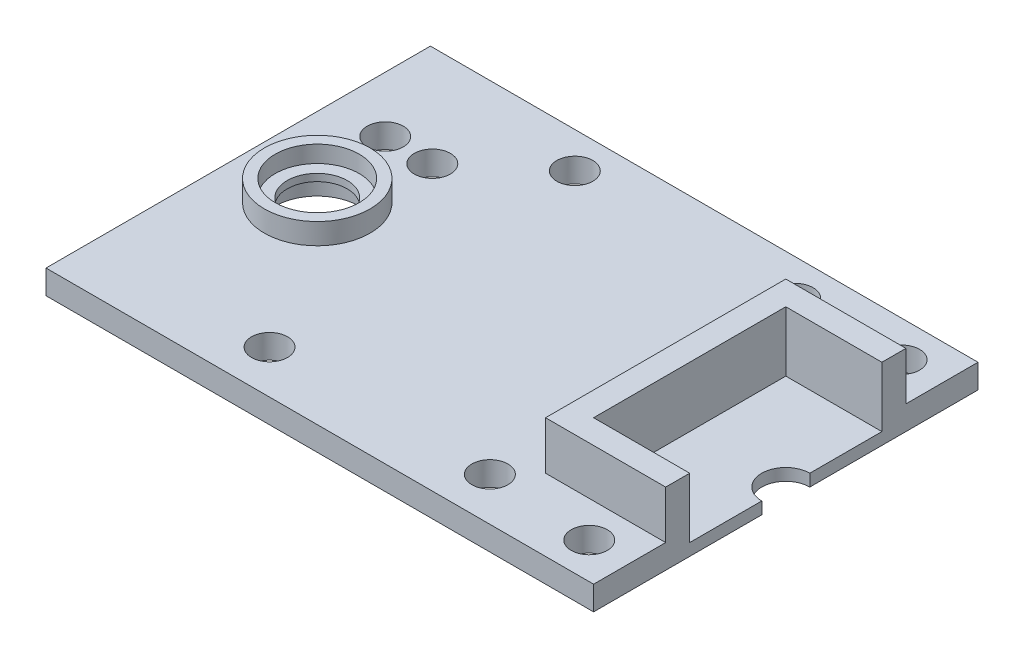
ISO-10303-21;
HEADER;
FILE_DESCRIPTION(('STEP AP214'),'2;1');
FILE_NAME('part.step','',(''),(''),'','','');
FILE_SCHEMA(('AUTOMOTIVE_DESIGN { 1 0 10303 214 1 1 1 1 }'));
ENDSEC;
DATA;
#1=APPLICATION_CONTEXT('core data for automotive mechanical design processes');
#2=APPLICATION_PROTOCOL_DEFINITION('international standard','automotive_design',2000,#1);
#3=PRODUCT_CONTEXT('',#1,'mechanical');
#4=PRODUCT('Part','Part','',(#3));
#5=PRODUCT_RELATED_PRODUCT_CATEGORY('part','',(#4));
#6=PRODUCT_DEFINITION_FORMATION('','',#4);
#7=PRODUCT_DEFINITION_CONTEXT('part definition',#1,'design');
#8=PRODUCT_DEFINITION('design','',#6,#7);
#9=PRODUCT_DEFINITION_SHAPE('','',#8);
#10=(LENGTH_UNIT() NAMED_UNIT(*) SI_UNIT(.MILLI.,.METRE.));
#11=(NAMED_UNIT(*) PLANE_ANGLE_UNIT() SI_UNIT($,.RADIAN.));
#12=(NAMED_UNIT(*) SI_UNIT($,.STERADIAN.) SOLID_ANGLE_UNIT());
#13=UNCERTAINTY_MEASURE_WITH_UNIT(LENGTH_MEASURE(1.E-05),#10,'distance_accuracy_value','');
#14=(GEOMETRIC_REPRESENTATION_CONTEXT(3) GLOBAL_UNCERTAINTY_ASSIGNED_CONTEXT((#13)) GLOBAL_UNIT_ASSIGNED_CONTEXT((#10,
#11,#12)) REPRESENTATION_CONTEXT('',''));
#15=CARTESIAN_POINT('',(0.,0.,0.));
#16=DIRECTION('',(0.,0.,1.));
#17=DIRECTION('',(1.,0.,0.));
#18=AXIS2_PLACEMENT_3D('',#15,#16,#17);
#19=CARTESIAN_POINT('',(-279.4,6.35,-50.8));
#20=DIRECTION('',(0.,0.,1.));
#21=DIRECTION('',(1.,0.,0.));
#22=AXIS2_PLACEMENT_3D('',#19,#20,#21);
#23=PLANE('',#22);
#24=DIRECTION('',(-1.,0.,0.));
#25=VECTOR('',#24,1.);
#26=CARTESIAN_POINT('',(-279.4,6.35,-50.8));
#27=LINE('',#26,#25);
#28=CARTESIAN_POINT('',(-134.66620377136,6.35000000000002,-50.8));
#29=VERTEX_POINT('',#28);
#30=CARTESIAN_POINT('',(-279.4,6.35,-50.8));
#31=VERTEX_POINT('',#30);
#32=EDGE_CURVE('E173',#29,#31,#27,.T.);
#33=ORIENTED_EDGE('',*,*,#32,.F.);
#34=DIRECTION('',(0.,-1.,0.));
#35=VECTOR('',#34,1.);
#36=CARTESIAN_POINT('',(-134.66620377136,396.437533588663,-50.8));
#37=LINE('',#36,#35);
#38=CARTESIAN_POINT('',(-134.66620377136,0.,-50.8));
#39=VERTEX_POINT('',#38);
#40=EDGE_CURVE('E160',#29,#39,#37,.T.);
#41=ORIENTED_EDGE('',*,*,#40,.T.);
#42=DIRECTION('',(-1.,0.,0.));
#43=VECTOR('',#42,1.);
#44=CARTESIAN_POINT('',(-279.4,0.,-50.8));
#45=LINE('',#44,#43);
#46=CARTESIAN_POINT('',(-279.4,0.,-50.8));
#47=VERTEX_POINT('',#46);
#48=EDGE_CURVE('E177',#39,#47,#45,.T.);
#49=ORIENTED_EDGE('',*,*,#48,.T.);
#50=DIRECTION('',(0.,-1.,0.));
#51=VECTOR('',#50,1.);
#52=CARTESIAN_POINT('',(-279.4,6.35,-50.8));
#53=LINE('',#52,#51);
#54=EDGE_CURVE('E171',#31,#47,#53,.T.);
#55=ORIENTED_EDGE('',*,*,#54,.F.);
#56=EDGE_LOOP('',(#33,#41,#49,#55));
#57=FACE_BOUND('',#56,.T.);
#58=ADVANCED_FACE('F40',(#57),#23,.F.);
#59=CARTESIAN_POINT('',(-279.4,6.35,50.8));
#60=DIRECTION('',(0.,0.,-1.));
#61=DIRECTION('',(-1.,0.,0.));
#62=AXIS2_PLACEMENT_3D('',#59,#60,#61);
#63=PLANE('',#62);
#64=DIRECTION('',(1.,0.,0.));
#65=VECTOR('',#64,1.);
#66=CARTESIAN_POINT('',(-279.4,0.,50.8));
#67=LINE('',#66,#65);
#68=CARTESIAN_POINT('',(-279.4,0.,50.8));
#69=VERTEX_POINT('',#68);
#70=CARTESIAN_POINT('',(-134.66620377136,0.,50.8));
#71=VERTEX_POINT('',#70);
#72=EDGE_CURVE('E158',#69,#71,#67,.T.);
#73=ORIENTED_EDGE('',*,*,#72,.T.);
#74=DIRECTION('',(0.,-1.,0.));
#75=VECTOR('',#74,1.);
#76=CARTESIAN_POINT('',(-134.66620377136,396.437533588663,50.8));
#77=LINE('',#76,#75);
#78=CARTESIAN_POINT('',(-134.66620377136,6.35000000000002,50.8));
#79=VERTEX_POINT('',#78);
#80=EDGE_CURVE('E141',#79,#71,#77,.T.);
#81=ORIENTED_EDGE('',*,*,#80,.F.);
#82=DIRECTION('',(1.,0.,0.));
#83=VECTOR('',#82,1.);
#84=CARTESIAN_POINT('',(-279.4,6.35,50.8));
#85=LINE('',#84,#83);
#86=CARTESIAN_POINT('',(-279.4,6.35,50.8));
#87=VERTEX_POINT('',#86);
#88=EDGE_CURVE('E156',#87,#79,#85,.T.);
#89=ORIENTED_EDGE('',*,*,#88,.F.);
#90=DIRECTION('',(0.,-1.,0.));
#91=VECTOR('',#90,1.);
#92=CARTESIAN_POINT('',(-279.4,6.35,50.8));
#93=LINE('',#92,#91);
#94=EDGE_CURVE('E167',#87,#69,#93,.T.);
#95=ORIENTED_EDGE('',*,*,#94,.T.);
#96=EDGE_LOOP('',(#73,#81,#89,#95));
#97=FACE_BOUND('',#96,.T.);
#98=ADVANCED_FACE('F154',(#97),#63,.F.);
#99=CARTESIAN_POINT('',(-134.66620377136,0.,0.));
#100=DIRECTION('',(0.,1.,0.));
#101=DIRECTION('',(0.,0.,1.));
#102=AXIS2_PLACEMENT_3D('',#99,#100,#101);
#103=CYLINDRICAL_SURFACE('',#102,6.35);
#104=CARTESIAN_POINT('',(-134.66620377136,3.175,0.));
#105=DIRECTION('',(0.,1.,0.));
#106=DIRECTION('',(0.,0.,1.));
#107=AXIS2_PLACEMENT_3D('',#104,#105,#106);
#108=CIRCLE('',#107,6.35);
#109=CARTESIAN_POINT('',(-134.66620377136,3.175,6.35));
#110=VERTEX_POINT('',#109);
#111=CARTESIAN_POINT('',(-134.66620377136,3.175,-6.35));
#112=VERTEX_POINT('',#111);
#113=EDGE_CURVE('E199',#110,#112,#108,.F.);
#114=ORIENTED_EDGE('',*,*,#113,.F.);
#115=DIRECTION('',(0.,1.,0.));
#116=VECTOR('',#115,1.);
#117=CARTESIAN_POINT('',(-134.66620377136,0.,6.35));
#118=LINE('',#117,#116);
#119=CARTESIAN_POINT('',(-134.66620377136,0.,6.35));
#120=VERTEX_POINT('',#119);
#121=EDGE_CURVE('E149',#110,#120,#118,.F.);
#122=ORIENTED_EDGE('',*,*,#121,.T.);
#123=CARTESIAN_POINT('',(-134.66620377136,0.,0.));
#124=DIRECTION('',(0.,1.,0.));
#125=DIRECTION('',(0.,0.,1.));
#126=AXIS2_PLACEMENT_3D('',#123,#124,#125);
#127=CIRCLE('',#126,6.35);
#128=CARTESIAN_POINT('',(-134.66620377136,0.,-6.35));
#129=VERTEX_POINT('',#128);
#130=EDGE_CURVE('E273',#129,#120,#127,.T.);
#131=ORIENTED_EDGE('',*,*,#130,.F.);
#132=DIRECTION('',(0.,1.,0.));
#133=VECTOR('',#132,1.);
#134=CARTESIAN_POINT('',(-134.66620377136,0.,-6.35));
#135=LINE('',#134,#133);
#136=EDGE_CURVE('E332',#129,#112,#135,.T.);
#137=ORIENTED_EDGE('',*,*,#136,.T.);
#138=EDGE_LOOP('',(#114,#122,#131,#137));
#139=FACE_BOUND('',#138,.T.);
#140=ADVANCED_FACE('F426',(#139),#103,.F.);
#141=CARTESIAN_POINT('',(0.,6.35,0.));
#142=DIRECTION('',(0.,-1.,0.));
#143=DIRECTION('',(0.,0.,-1.));
#144=AXIS2_PLACEMENT_3D('',#141,#142,#143);
#145=PLANE('',#144);
#146=CARTESIAN_POINT('',(-264.668,6.35,-24.13));
#147=DIRECTION('',(0.,1.,0.));
#148=DIRECTION('',(0.,0.,1.));
#149=AXIS2_PLACEMENT_3D('',#146,#147,#148);
#150=CIRCLE('',#149,4.76250000000001);
#151=CARTESIAN_POINT('',(-264.668,6.35,-19.3675));
#152=VERTEX_POINT('',#151);
#153=EDGE_CURVE('E340',#152,#152,#150,.T.);
#154=ORIENTED_EDGE('',*,*,#153,.F.);
#155=EDGE_LOOP('',(#154));
#156=FACE_BOUND('',#155,.T.);
#157=CARTESIAN_POINT('',(-252.222,6.35,-24.13));
#158=DIRECTION('',(0.,1.,0.));
#159=DIRECTION('',(0.,0.,1.));
#160=AXIS2_PLACEMENT_3D('',#157,#158,#159);
#161=CIRCLE('',#160,4.76250000000001);
#162=CARTESIAN_POINT('',(-252.222,6.35,-19.3675));
#163=VERTEX_POINT('',#162);
#164=EDGE_CURVE('E339',#163,#163,#161,.T.);
#165=ORIENTED_EDGE('',*,*,#164,.F.);
#166=EDGE_LOOP('',(#165));
#167=FACE_BOUND('',#166,.T.);
#168=CARTESIAN_POINT('',(-145.33420377136,6.35,-41.275));
#169=DIRECTION('',(0.,-1.,0.));
#170=DIRECTION('',(0.,0.,-1.));
#171=AXIS2_PLACEMENT_3D('',#168,#169,#170);
#172=CIRCLE('',#171,4.76250000000001);
#173=CARTESIAN_POINT('',(-145.33420377136,6.35,-46.0375));
#174=VERTEX_POINT('',#173);
#175=EDGE_CURVE('E349',#174,#174,#172,.T.);
#176=ORIENTED_EDGE('',*,*,#175,.T.);
#177=EDGE_LOOP('',(#176));
#178=FACE_BOUND('',#177,.T.);
#179=CARTESIAN_POINT('',(-145.33420377136,6.35,41.275));
#180=DIRECTION('',(0.,1.,0.));
#181=DIRECTION('',(0.,0.,1.));
#182=AXIS2_PLACEMENT_3D('',#179,#180,#181);
#183=CIRCLE('',#182,4.76250000000001);
#184=CARTESIAN_POINT('',(-145.33420377136,6.35,46.0375));
#185=VERTEX_POINT('',#184);
#186=EDGE_CURVE('E360',#185,#185,#183,.T.);
#187=ORIENTED_EDGE('',*,*,#186,.F.);
#188=EDGE_LOOP('',(#187));
#189=FACE_BOUND('',#188,.T.);
#190=CARTESIAN_POINT('',(-173.509244294,6.35,-41.324145444));
#191=DIRECTION('',(0.,1.,0.));
#192=DIRECTION('',(0.,0.,1.));
#193=AXIS2_PLACEMENT_3D('',#190,#191,#192);
#194=CIRCLE('',#193,4.76250000000001);
#195=CARTESIAN_POINT('',(-173.509244294,6.35,-36.561645444));
#196=VERTEX_POINT('',#195);
#197=EDGE_CURVE('E368',#196,#196,#194,.T.);
#198=ORIENTED_EDGE('',*,*,#197,.F.);
#199=EDGE_LOOP('',(#198));
#200=FACE_BOUND('',#199,.T.);
#201=CARTESIAN_POINT('',(-173.509244294,6.35,39.369341378));
#202=DIRECTION('',(0.,1.,0.));
#203=DIRECTION('',(0.,0.,1.));
#204=AXIS2_PLACEMENT_3D('',#201,#202,#203);
#205=CIRCLE('',#204,4.76250000000001);
#206=CARTESIAN_POINT('',(-173.509244294,6.35,44.131841378));
#207=VERTEX_POINT('',#206);
#208=EDGE_CURVE('E382',#207,#207,#205,.T.);
#209=ORIENTED_EDGE('',*,*,#208,.F.);
#210=EDGE_LOOP('',(#209));
#211=FACE_BOUND('',#210,.T.);
#212=CARTESIAN_POINT('',(-231.7492444,6.35,39.369341378));
#213=DIRECTION('',(0.,1.,0.));
#214=DIRECTION('',(0.,0.,1.));
#215=AXIS2_PLACEMENT_3D('',#212,#213,#214);
#216=CIRCLE('',#215,4.76250000000001);
#217=CARTESIAN_POINT('',(-231.7492444,6.35,44.131841378));
#218=VERTEX_POINT('',#217);
#219=EDGE_CURVE('E372',#218,#218,#216,.T.);
#220=ORIENTED_EDGE('',*,*,#219,.F.);
#221=EDGE_LOOP('',(#220));
#222=FACE_BOUND('',#221,.T.);
#223=CARTESIAN_POINT('',(-231.7492444,6.35,-41.324145444));
#224=DIRECTION('',(0.,1.,0.));
#225=DIRECTION('',(0.,0.,1.));
#226=AXIS2_PLACEMENT_3D('',#223,#224,#225);
#227=CIRCLE('',#226,4.76250000000001);
#228=CARTESIAN_POINT('',(-231.7492444,6.35,-36.561645444));
#229=VERTEX_POINT('',#228);
#230=EDGE_CURVE('E381',#229,#229,#227,.T.);
#231=ORIENTED_EDGE('',*,*,#230,.F.);
#232=EDGE_LOOP('',(#231));
#233=FACE_BOUND('',#232,.T.);
#234=CARTESIAN_POINT('',(-258.510557856653,6.35,0.));
#235=DIRECTION('',(0.,-1.,0.));
#236=DIRECTION('',(0.,0.,-1.));
#237=AXIS2_PLACEMENT_3D('',#234,#235,#236);
#238=CIRCLE('',#237,13.97);
#239=CARTESIAN_POINT('',(-258.510557856653,6.35,-13.97));
#240=VERTEX_POINT('',#239);
#241=EDGE_CURVE('E189',#240,#240,#238,.F.);
#242=ORIENTED_EDGE('',*,*,#241,.F.);
#243=EDGE_LOOP('',(#242));
#244=FACE_BOUND('',#243,.T.);
#245=ORIENTED_EDGE('',*,*,#88,.T.);
#246=DIRECTION('',(0.,0.,-1.));
#247=VECTOR('',#246,1.);
#248=CARTESIAN_POINT('',(-134.66620377136,6.35,0.));
#249=LINE('',#248,#247);
#250=CARTESIAN_POINT('',(-134.66620377136,6.35,31.75));
#251=VERTEX_POINT('',#250);
#252=EDGE_CURVE('E138',#79,#251,#249,.T.);
#253=ORIENTED_EDGE('',*,*,#252,.T.);
#254=DIRECTION('',(1.,0.,0.));
#255=VECTOR('',#254,1.);
#256=CARTESIAN_POINT('',(-102.91620377136,6.35,31.75));
#257=LINE('',#256,#255);
#258=CARTESIAN_POINT('',(-166.41620377136,6.35,31.75));
#259=VERTEX_POINT('',#258);
#260=EDGE_CURVE('E261',#259,#251,#257,.T.);
#261=ORIENTED_EDGE('',*,*,#260,.F.);
#262=DIRECTION('',(0.,0.,1.));
#263=VECTOR('',#262,1.);
#264=CARTESIAN_POINT('',(-166.41620377136,6.35,31.75));
#265=LINE('',#264,#263);
#266=CARTESIAN_POINT('',(-166.41620377136,6.35,-31.75));
#267=VERTEX_POINT('',#266);
#268=EDGE_CURVE('E202',#267,#259,#265,.T.);
#269=ORIENTED_EDGE('',*,*,#268,.F.);
#270=DIRECTION('',(-1.,0.,0.));
#271=VECTOR('',#270,1.);
#272=CARTESIAN_POINT('',(-102.91620377136,6.35,-31.75));
#273=LINE('',#272,#271);
#274=CARTESIAN_POINT('',(-134.66620377136,6.35,-31.75));
#275=VERTEX_POINT('',#274);
#276=EDGE_CURVE('E250',#275,#267,#273,.T.);
#277=ORIENTED_EDGE('',*,*,#276,.F.);
#278=DIRECTION('',(0.,0.,-1.));
#279=VECTOR('',#278,1.);
#280=CARTESIAN_POINT('',(-134.66620377136,6.35,0.));
#281=LINE('',#280,#279);
#282=EDGE_CURVE('E302',#275,#29,#281,.T.);
#283=ORIENTED_EDGE('',*,*,#282,.T.);
#284=ORIENTED_EDGE('',*,*,#32,.T.);
#285=DIRECTION('',(0.,0.,1.));
#286=VECTOR('',#285,1.);
#287=CARTESIAN_POINT('',(-279.4,6.35,50.8));
#288=LINE('',#287,#286);
#289=EDGE_CURVE('E164',#31,#87,#288,.T.);
#290=ORIENTED_EDGE('',*,*,#289,.T.);
#291=EDGE_LOOP('',(#245,#253,#261,#269,#277,#283,#284,#290));
#292=FACE_BOUND('',#291,.T.);
#293=ADVANCED_FACE('F162',(#156,#167,#178,#189,#200,#211,#222,#233,#244,#292),#145,.F.);
#294=CARTESIAN_POINT('',(-279.4,6.35,50.8));
#295=DIRECTION('',(1.,0.,0.));
#296=DIRECTION('',(0.,0.,-1.));
#297=AXIS2_PLACEMENT_3D('',#294,#295,#296);
#298=PLANE('',#297);
#299=DIRECTION('',(0.,0.,1.));
#300=VECTOR('',#299,1.);
#301=CARTESIAN_POINT('',(-279.4,0.,50.8));
#302=LINE('',#301,#300);
#303=EDGE_CURVE('E180',#47,#69,#302,.T.);
#304=ORIENTED_EDGE('',*,*,#303,.T.);
#305=ORIENTED_EDGE('',*,*,#94,.F.);
#306=ORIENTED_EDGE('',*,*,#289,.F.);
#307=ORIENTED_EDGE('',*,*,#54,.T.);
#308=EDGE_LOOP('',(#304,#305,#306,#307));
#309=FACE_BOUND('',#308,.T.);
#310=ADVANCED_FACE('F308',(#309),#298,.F.);
#311=CARTESIAN_POINT('',(0.,0.,0.));
#312=DIRECTION('',(0.,-1.,0.));
#313=DIRECTION('',(0.,0.,-1.));
#314=AXIS2_PLACEMENT_3D('',#311,#312,#313);
#315=PLANE('',#314);
#316=DIRECTION('',(0.,0.,-1.));
#317=VECTOR('',#316,1.);
#318=CARTESIAN_POINT('',(-134.66620377136,0.,0.));
#319=LINE('',#318,#317);
#320=EDGE_CURVE('E312',#71,#120,#319,.T.);
#321=ORIENTED_EDGE('',*,*,#320,.F.);
#322=ORIENTED_EDGE('',*,*,#72,.F.);
#323=ORIENTED_EDGE('',*,*,#303,.F.);
#324=ORIENTED_EDGE('',*,*,#48,.F.);
#325=DIRECTION('',(0.,0.,-1.));
#326=VECTOR('',#325,1.);
#327=CARTESIAN_POINT('',(-134.66620377136,0.,0.));
#328=LINE('',#327,#326);
#329=EDGE_CURVE('E336',#129,#39,#328,.T.);
#330=ORIENTED_EDGE('',*,*,#329,.F.);
#331=ORIENTED_EDGE('',*,*,#130,.T.);
#332=EDGE_LOOP('',(#321,#322,#323,#324,#330,#331));
#333=FACE_BOUND('',#332,.T.);
#334=CARTESIAN_POINT('',(-264.668,0.,-24.13));
#335=DIRECTION('',(0.,-1.,0.));
#336=DIRECTION('',(0.,0.,-1.));
#337=AXIS2_PLACEMENT_3D('',#334,#335,#336);
#338=CIRCLE('',#337,4.76250000000001);
#339=CARTESIAN_POINT('',(-264.668,0.,-28.8925));
#340=VERTEX_POINT('',#339);
#341=EDGE_CURVE('E344',#340,#340,#338,.F.);
#342=ORIENTED_EDGE('',*,*,#341,.T.);
#343=EDGE_LOOP('',(#342));
#344=FACE_BOUND('',#343,.T.);
#345=CARTESIAN_POINT('',(-252.222,0.,-24.13));
#346=DIRECTION('',(0.,-1.,0.));
#347=DIRECTION('',(0.,0.,-1.));
#348=AXIS2_PLACEMENT_3D('',#345,#346,#347);
#349=CIRCLE('',#348,4.76250000000001);
#350=CARTESIAN_POINT('',(-252.222,0.,-28.8925));
#351=VERTEX_POINT('',#350);
#352=EDGE_CURVE('E345',#351,#351,#349,.F.);
#353=ORIENTED_EDGE('',*,*,#352,.T.);
#354=EDGE_LOOP('',(#353));
#355=FACE_BOUND('',#354,.T.);
#356=CARTESIAN_POINT('',(-145.33420377136,0.,-41.275));
#357=DIRECTION('',(0.,-1.,0.));
#358=DIRECTION('',(0.,0.,-1.));
#359=AXIS2_PLACEMENT_3D('',#356,#357,#358);
#360=CIRCLE('',#359,4.76250000000001);
#361=CARTESIAN_POINT('',(-145.33420377136,0.,-46.0375));
#362=VERTEX_POINT('',#361);
#363=EDGE_CURVE('E356',#362,#362,#360,.T.);
#364=ORIENTED_EDGE('',*,*,#363,.F.);
#365=EDGE_LOOP('',(#364));
#366=FACE_BOUND('',#365,.T.);
#367=CARTESIAN_POINT('',(-145.33420377136,0.,41.275));
#368=DIRECTION('',(0.,1.,0.));
#369=DIRECTION('',(0.,0.,1.));
#370=AXIS2_PLACEMENT_3D('',#367,#368,#369);
#371=CIRCLE('',#370,4.76250000000001);
#372=CARTESIAN_POINT('',(-145.33420377136,0.,46.0375));
#373=VERTEX_POINT('',#372);
#374=EDGE_CURVE('E364',#373,#373,#371,.T.);
#375=ORIENTED_EDGE('',*,*,#374,.T.);
#376=EDGE_LOOP('',(#375));
#377=FACE_BOUND('',#376,.T.);
#378=CARTESIAN_POINT('',(-173.509244294,0.,-41.324145444));
#379=DIRECTION('',(0.,-1.,0.));
#380=DIRECTION('',(0.,0.,-1.));
#381=AXIS2_PLACEMENT_3D('',#378,#379,#380);
#382=CIRCLE('',#381,4.76250000000001);
#383=CARTESIAN_POINT('',(-173.509244294,0.,-46.086645444));
#384=VERTEX_POINT('',#383);
#385=EDGE_CURVE('E386',#384,#384,#382,.F.);
#386=ORIENTED_EDGE('',*,*,#385,.T.);
#387=EDGE_LOOP('',(#386));
#388=FACE_BOUND('',#387,.T.);
#389=CARTESIAN_POINT('',(-173.509244294,0.,39.369341378));
#390=DIRECTION('',(0.,-1.,0.));
#391=DIRECTION('',(0.,0.,-1.));
#392=AXIS2_PLACEMENT_3D('',#389,#390,#391);
#393=CIRCLE('',#392,4.76250000000001);
#394=CARTESIAN_POINT('',(-173.509244294,0.,34.606841378));
#395=VERTEX_POINT('',#394);
#396=EDGE_CURVE('E377',#395,#395,#393,.F.);
#397=ORIENTED_EDGE('',*,*,#396,.T.);
#398=EDGE_LOOP('',(#397));
#399=FACE_BOUND('',#398,.T.);
#400=CARTESIAN_POINT('',(-231.7492444,0.,39.369341378));
#401=DIRECTION('',(0.,-1.,0.));
#402=DIRECTION('',(0.,0.,-1.));
#403=AXIS2_PLACEMENT_3D('',#400,#401,#402);
#404=CIRCLE('',#403,4.76250000000001);
#405=CARTESIAN_POINT('',(-231.7492444,0.,34.606841378));
#406=VERTEX_POINT('',#405);
#407=EDGE_CURVE('E376',#406,#406,#404,.F.);
#408=ORIENTED_EDGE('',*,*,#407,.T.);
#409=EDGE_LOOP('',(#408));
#410=FACE_BOUND('',#409,.T.);
#411=CARTESIAN_POINT('',(-231.7492444,0.,-41.324145444));
#412=DIRECTION('',(0.,-1.,0.));
#413=DIRECTION('',(0.,0.,-1.));
#414=AXIS2_PLACEMENT_3D('',#411,#412,#413);
#415=CIRCLE('',#414,4.76250000000001);
#416=CARTESIAN_POINT('',(-231.7492444,0.,-46.086645444));
#417=VERTEX_POINT('',#416);
#418=EDGE_CURVE('E235',#417,#417,#415,.F.);
#419=ORIENTED_EDGE('',*,*,#418,.T.);
#420=EDGE_LOOP('',(#419));
#421=FACE_BOUND('',#420,.T.);
#422=CARTESIAN_POINT('',(-258.510557856653,0.,0.));
#423=DIRECTION('',(0.,-1.,0.));
#424=DIRECTION('',(0.,0.,-1.));
#425=AXIS2_PLACEMENT_3D('',#422,#423,#424);
#426=CIRCLE('',#425,11.1125);
#427=CARTESIAN_POINT('',(-258.510557856653,0.,-11.1125));
#428=VERTEX_POINT('',#427);
#429=EDGE_CURVE('E197',#428,#428,#426,.T.);
#430=ORIENTED_EDGE('',*,*,#429,.F.);
#431=EDGE_LOOP('',(#430));
#432=FACE_BOUND('',#431,.T.);
#433=ADVANCED_FACE('F310',(#333,#344,#355,#366,#377,#388,#399,#410,#421,#432),#315,.T.);
#434=CARTESIAN_POINT('',(-258.510557856653,11.90625,0.));
#435=DIRECTION('',(0.,-1.,0.));
#436=DIRECTION('',(0.,0.,-1.));
#437=AXIS2_PLACEMENT_3D('',#434,#435,#436);
#438=CYLINDRICAL_SURFACE('',#437,13.97);
#439=CARTESIAN_POINT('',(-258.510557856653,11.90625,0.));
#440=DIRECTION('',(0.,1.,0.));
#441=DIRECTION('',(0.,0.,1.));
#442=AXIS2_PLACEMENT_3D('',#439,#440,#441);
#443=CIRCLE('',#442,13.97);
#444=CARTESIAN_POINT('',(-258.510557856653,11.90625,13.97));
#445=VERTEX_POINT('',#444);
#446=EDGE_CURVE('E181',#445,#445,#443,.T.);
#447=ORIENTED_EDGE('',*,*,#446,.F.);
#448=EDGE_LOOP('',(#447));
#449=FACE_BOUND('',#448,.T.);
#450=ORIENTED_EDGE('',*,*,#241,.T.);
#451=EDGE_LOOP('',(#450));
#452=FACE_BOUND('',#451,.T.);
#453=ADVANCED_FACE('F441',(#449,#452),#438,.T.);
#454=CARTESIAN_POINT('',(-258.510557856653,11.90625,0.));
#455=DIRECTION('',(0.,1.,0.));
#456=DIRECTION('',(0.,0.,1.));
#457=AXIS2_PLACEMENT_3D('',#454,#455,#456);
#458=PLANE('',#457);
#459=CARTESIAN_POINT('',(-258.510557856653,11.90625,0.));
#460=DIRECTION('',(0.,1.,0.));
#461=DIRECTION('',(0.,0.,1.));
#462=AXIS2_PLACEMENT_3D('',#459,#460,#461);
#463=CIRCLE('',#462,11.1125);
#464=CARTESIAN_POINT('',(-258.510557856653,11.90625,11.1125));
#465=VERTEX_POINT('',#464);
#466=EDGE_CURVE('E284',#465,#465,#463,.T.);
#467=ORIENTED_EDGE('',*,*,#466,.F.);
#468=EDGE_LOOP('',(#467));
#469=FACE_BOUND('',#468,.T.);
#470=ORIENTED_EDGE('',*,*,#446,.T.);
#471=EDGE_LOOP('',(#470));
#472=FACE_BOUND('',#471,.T.);
#473=ADVANCED_FACE('F450',(#469,#472),#458,.T.);
#474=CARTESIAN_POINT('',(-258.510557856653,7.46125,0.));
#475=DIRECTION('',(0.,1.,0.));
#476=DIRECTION('',(0.,0.,1.));
#477=AXIS2_PLACEMENT_3D('',#474,#475,#476);
#478=CYLINDRICAL_SURFACE('',#477,11.1125);
#479=CARTESIAN_POINT('',(-258.510557856653,7.46125,0.));
#480=DIRECTION('',(0.,1.,0.));
#481=DIRECTION('',(0.,0.,1.));
#482=AXIS2_PLACEMENT_3D('',#479,#480,#481);
#483=CIRCLE('',#482,11.1125);
#484=CARTESIAN_POINT('',(-258.510557856653,7.46125,11.1125));
#485=VERTEX_POINT('',#484);
#486=EDGE_CURVE('E288',#485,#485,#483,.T.);
#487=ORIENTED_EDGE('',*,*,#486,.F.);
#488=EDGE_LOOP('',(#487));
#489=FACE_BOUND('',#488,.T.);
#490=ORIENTED_EDGE('',*,*,#466,.T.);
#491=EDGE_LOOP('',(#490));
#492=FACE_BOUND('',#491,.T.);
#493=ADVANCED_FACE('F454',(#489,#492),#478,.F.);
#494=CARTESIAN_POINT('',(-258.510557856653,7.46125,0.));
#495=DIRECTION('',(0.,1.,0.));
#496=DIRECTION('',(0.,0.,1.));
#497=AXIS2_PLACEMENT_3D('',#494,#495,#496);
#498=PLANE('',#497);
#499=CARTESIAN_POINT('',(-258.510557856653,7.46125,0.));
#500=DIRECTION('',(0.,1.,0.));
#501=DIRECTION('',(0.,0.,1.));
#502=AXIS2_PLACEMENT_3D('',#499,#500,#501);
#503=CIRCLE('',#502,7.93749999999998);
#504=CARTESIAN_POINT('',(-258.510557856653,7.46125,7.93749999999998));
#505=VERTEX_POINT('',#504);
#506=EDGE_CURVE('E198',#505,#505,#503,.T.);
#507=ORIENTED_EDGE('',*,*,#506,.F.);
#508=EDGE_LOOP('',(#507));
#509=FACE_BOUND('',#508,.T.);
#510=ORIENTED_EDGE('',*,*,#486,.T.);
#511=EDGE_LOOP('',(#510));
#512=FACE_BOUND('',#511,.T.);
#513=ADVANCED_FACE('F458',(#509,#512),#498,.T.);
#514=CARTESIAN_POINT('',(-258.510557856653,5.55625,0.));
#515=DIRECTION('',(0.,-1.,0.));
#516=DIRECTION('',(0.,0.,-1.));
#517=AXIS2_PLACEMENT_3D('',#514,#515,#516);
#518=CYLINDRICAL_SURFACE('',#517,11.1125);
#519=CARTESIAN_POINT('',(-258.510557856653,5.55625,0.));
#520=DIRECTION('',(0.,-1.,0.));
#521=DIRECTION('',(0.,0.,-1.));
#522=AXIS2_PLACEMENT_3D('',#519,#520,#521);
#523=CIRCLE('',#522,11.1125);
#524=CARTESIAN_POINT('',(-258.510557856653,5.55625,-11.1125));
#525=VERTEX_POINT('',#524);
#526=EDGE_CURVE('E280',#525,#525,#523,.T.);
#527=ORIENTED_EDGE('',*,*,#526,.F.);
#528=EDGE_LOOP('',(#527));
#529=FACE_BOUND('',#528,.T.);
#530=ORIENTED_EDGE('',*,*,#429,.T.);
#531=EDGE_LOOP('',(#530));
#532=FACE_BOUND('',#531,.T.);
#533=ADVANCED_FACE('F462',(#529,#532),#518,.F.);
#534=CARTESIAN_POINT('',(-258.510557856653,5.55625,0.));
#535=DIRECTION('',(0.,-1.,0.));
#536=DIRECTION('',(0.,0.,-1.));
#537=AXIS2_PLACEMENT_3D('',#534,#535,#536);
#538=PLANE('',#537);
#539=CARTESIAN_POINT('',(-258.510557856653,5.55625,0.));
#540=DIRECTION('',(0.,-1.,0.));
#541=DIRECTION('',(0.,0.,-1.));
#542=AXIS2_PLACEMENT_3D('',#539,#540,#541);
#543=CIRCLE('',#542,7.93749999999998);
#544=CARTESIAN_POINT('',(-258.510557856653,5.55625,-7.93749999999998));
#545=VERTEX_POINT('',#544);
#546=EDGE_CURVE('E193',#545,#545,#543,.T.);
#547=ORIENTED_EDGE('',*,*,#546,.F.);
#548=EDGE_LOOP('',(#547));
#549=FACE_BOUND('',#548,.T.);
#550=ORIENTED_EDGE('',*,*,#526,.T.);
#551=EDGE_LOOP('',(#550));
#552=FACE_BOUND('',#551,.T.);
#553=ADVANCED_FACE('F466',(#549,#552),#538,.T.);
#554=CARTESIAN_POINT('',(-258.510557856653,0.,0.));
#555=DIRECTION('',(0.,1.,0.));
#556=DIRECTION('',(0.,0.,1.));
#557=AXIS2_PLACEMENT_3D('',#554,#555,#556);
#558=CYLINDRICAL_SURFACE('',#557,7.93749999999998);
#559=ORIENTED_EDGE('',*,*,#546,.T.);
#560=EDGE_LOOP('',(#559));
#561=FACE_BOUND('',#560,.T.);
#562=ORIENTED_EDGE('',*,*,#506,.T.);
#563=EDGE_LOOP('',(#562));
#564=FACE_BOUND('',#563,.T.);
#565=ADVANCED_FACE('F470',(#561,#564),#558,.F.);
#566=CARTESIAN_POINT('',(-166.41620377136,19.05,31.75));
#567=DIRECTION('',(1.,0.,0.));
#568=DIRECTION('',(0.,0.,-1.));
#569=AXIS2_PLACEMENT_3D('',#566,#567,#568);
#570=PLANE('',#569);
#571=ORIENTED_EDGE('',*,*,#268,.T.);
#572=DIRECTION('',(0.,-1.,0.));
#573=VECTOR('',#572,1.);
#574=CARTESIAN_POINT('',(-166.41620377136,19.05,31.75));
#575=LINE('',#574,#573);
#576=CARTESIAN_POINT('',(-166.41620377136,19.05,31.75));
#577=VERTEX_POINT('',#576);
#578=EDGE_CURVE('E269',#577,#259,#575,.T.);
#579=ORIENTED_EDGE('',*,*,#578,.F.);
#580=DIRECTION('',(0.,0.,1.));
#581=VECTOR('',#580,1.);
#582=CARTESIAN_POINT('',(-166.41620377136,19.05,31.75));
#583=LINE('',#582,#581);
#584=CARTESIAN_POINT('',(-166.41620377136,19.05,-31.75));
#585=VERTEX_POINT('',#584);
#586=EDGE_CURVE('E245',#585,#577,#583,.T.);
#587=ORIENTED_EDGE('',*,*,#586,.F.);
#588=DIRECTION('',(0.,-1.,0.));
#589=VECTOR('',#588,1.);
#590=CARTESIAN_POINT('',(-166.41620377136,19.05,-31.75));
#591=LINE('',#590,#589);
#592=EDGE_CURVE('E257',#585,#267,#591,.T.);
#593=ORIENTED_EDGE('',*,*,#592,.T.);
#594=EDGE_LOOP('',(#571,#579,#587,#593));
#595=FACE_BOUND('',#594,.T.);
#596=ADVANCED_FACE('F473',(#595),#570,.F.);
#597=CARTESIAN_POINT('',(-102.91620377136,19.05,31.75));
#598=DIRECTION('',(0.,0.,-1.));
#599=DIRECTION('',(-1.,0.,0.));
#600=AXIS2_PLACEMENT_3D('',#597,#598,#599);
#601=PLANE('',#600);
#602=ORIENTED_EDGE('',*,*,#260,.T.);
#603=DIRECTION('',(0.,1.,0.));
#604=VECTOR('',#603,1.);
#605=CARTESIAN_POINT('',(-134.66620377136,19.05,31.75));
#606=LINE('',#605,#604);
#607=CARTESIAN_POINT('',(-134.66620377136,19.05,31.75));
#608=VERTEX_POINT('',#607);
#609=EDGE_CURVE('E144',#251,#608,#606,.T.);
#610=ORIENTED_EDGE('',*,*,#609,.T.);
#611=DIRECTION('',(1.,0.,0.));
#612=VECTOR('',#611,1.);
#613=CARTESIAN_POINT('',(-102.91620377136,19.05,31.75));
#614=LINE('',#613,#612);
#615=EDGE_CURVE('E249',#577,#608,#614,.T.);
#616=ORIENTED_EDGE('',*,*,#615,.F.);
#617=ORIENTED_EDGE('',*,*,#578,.T.);
#618=EDGE_LOOP('',(#602,#610,#616,#617));
#619=FACE_BOUND('',#618,.T.);
#620=ADVANCED_FACE('F478',(#619),#601,.F.);
#621=CARTESIAN_POINT('',(-102.91620377136,19.05,-31.75));
#622=DIRECTION('',(0.,0.,1.));
#623=DIRECTION('',(1.,0.,0.));
#624=AXIS2_PLACEMENT_3D('',#621,#622,#623);
#625=PLANE('',#624);
#626=DIRECTION('',(-1.,0.,0.));
#627=VECTOR('',#626,1.);
#628=CARTESIAN_POINT('',(-102.91620377136,19.05,-31.75));
#629=LINE('',#628,#627);
#630=CARTESIAN_POINT('',(-134.66620377136,19.05,-31.75));
#631=VERTEX_POINT('',#630);
#632=EDGE_CURVE('E254',#631,#585,#629,.T.);
#633=ORIENTED_EDGE('',*,*,#632,.F.);
#634=DIRECTION('',(0.,-1.,0.));
#635=VECTOR('',#634,1.);
#636=CARTESIAN_POINT('',(-134.66620377136,19.05,-31.75));
#637=LINE('',#636,#635);
#638=EDGE_CURVE('E326',#631,#275,#637,.T.);
#639=ORIENTED_EDGE('',*,*,#638,.T.);
#640=ORIENTED_EDGE('',*,*,#276,.T.);
#641=ORIENTED_EDGE('',*,*,#592,.F.);
#642=EDGE_LOOP('',(#633,#639,#640,#641));
#643=FACE_BOUND('',#642,.T.);
#644=ADVANCED_FACE('F482',(#643),#625,.F.);
#645=CARTESIAN_POINT('',(0.,19.05,0.));
#646=DIRECTION('',(0.,1.,0.));
#647=DIRECTION('',(0.,0.,1.));
#648=AXIS2_PLACEMENT_3D('',#645,#646,#647);
#649=PLANE('',#648);
#650=DIRECTION('',(0.,0.,1.));
#651=VECTOR('',#650,1.);
#652=CARTESIAN_POINT('',(-134.66620377136,19.05,0.));
#653=LINE('',#652,#651);
#654=CARTESIAN_POINT('',(-134.66620377136,19.05,25.4));
#655=VERTEX_POINT('',#654);
#656=EDGE_CURVE('E751',#655,#608,#653,.T.);
#657=ORIENTED_EDGE('',*,*,#656,.F.);
#658=DIRECTION('',(1.,0.,0.));
#659=VECTOR('',#658,1.);
#660=CARTESIAN_POINT('',(-109.26620377136,19.05,25.4));
#661=LINE('',#660,#659);
#662=CARTESIAN_POINT('',(-160.06620377136,19.05,25.4));
#663=VERTEX_POINT('',#662);
#664=EDGE_CURVE('E214',#663,#655,#661,.T.);
#665=ORIENTED_EDGE('',*,*,#664,.F.);
#666=DIRECTION('',(0.,0.,1.));
#667=VECTOR('',#666,1.);
#668=CARTESIAN_POINT('',(-160.06620377136,19.05,25.4));
#669=LINE('',#668,#667);
#670=CARTESIAN_POINT('',(-160.06620377136,19.05,-25.4));
#671=VERTEX_POINT('',#670);
#672=EDGE_CURVE('E232',#671,#663,#669,.T.);
#673=ORIENTED_EDGE('',*,*,#672,.F.);
#674=DIRECTION('',(-1.,0.,0.));
#675=VECTOR('',#674,1.);
#676=CARTESIAN_POINT('',(-109.26620377136,19.05,-25.4));
#677=LINE('',#676,#675);
#678=CARTESIAN_POINT('',(-134.66620377136,19.05,-25.4));
#679=VERTEX_POINT('',#678);
#680=EDGE_CURVE('E228',#679,#671,#677,.T.);
#681=ORIENTED_EDGE('',*,*,#680,.F.);
#682=DIRECTION('',(0.,0.,1.));
#683=VECTOR('',#682,1.);
#684=CARTESIAN_POINT('',(-134.66620377136,19.05,0.));
#685=LINE('',#684,#683);
#686=EDGE_CURVE('E55',#631,#679,#685,.T.);
#687=ORIENTED_EDGE('',*,*,#686,.F.);
#688=ORIENTED_EDGE('',*,*,#632,.T.);
#689=ORIENTED_EDGE('',*,*,#586,.T.);
#690=ORIENTED_EDGE('',*,*,#615,.T.);
#691=EDGE_LOOP('',(#657,#665,#673,#681,#687,#688,#689,#690));
#692=FACE_BOUND('',#691,.T.);
#693=ADVANCED_FACE('F486',(#692),#649,.T.);
#694=CARTESIAN_POINT('',(0.,3.175,0.));
#695=DIRECTION('',(0.,1.,0.));
#696=DIRECTION('',(0.,0.,1.));
#697=AXIS2_PLACEMENT_3D('',#694,#695,#696);
#698=PLANE('',#697);
#699=DIRECTION('',(0.,0.,1.));
#700=VECTOR('',#699,1.);
#701=CARTESIAN_POINT('',(-134.66620377136,3.175,0.));
#702=LINE('',#701,#700);
#703=CARTESIAN_POINT('',(-134.66620377136,3.175,25.4));
#704=VERTEX_POINT('',#703);
#705=EDGE_CURVE('E62',#110,#704,#702,.T.);
#706=ORIENTED_EDGE('',*,*,#705,.F.);
#707=ORIENTED_EDGE('',*,*,#113,.T.);
#708=DIRECTION('',(0.,0.,1.));
#709=VECTOR('',#708,1.);
#710=CARTESIAN_POINT('',(-134.66620377136,3.175,0.));
#711=LINE('',#710,#709);
#712=CARTESIAN_POINT('',(-134.66620377136,3.175,-25.4));
#713=VERTEX_POINT('',#712);
#714=EDGE_CURVE('E317',#713,#112,#711,.T.);
#715=ORIENTED_EDGE('',*,*,#714,.F.);
#716=DIRECTION('',(-1.,0.,0.));
#717=VECTOR('',#716,1.);
#718=CARTESIAN_POINT('',(-109.26620377136,3.175,-25.4));
#719=LINE('',#718,#717);
#720=CARTESIAN_POINT('',(-160.06620377136,3.175,-25.4));
#721=VERTEX_POINT('',#720);
#722=EDGE_CURVE('E222',#713,#721,#719,.T.);
#723=ORIENTED_EDGE('',*,*,#722,.T.);
#724=DIRECTION('',(0.,0.,1.));
#725=VECTOR('',#724,1.);
#726=CARTESIAN_POINT('',(-160.06620377136,3.175,25.4));
#727=LINE('',#726,#725);
#728=CARTESIAN_POINT('',(-160.06620377136,3.175,25.4));
#729=VERTEX_POINT('',#728);
#730=EDGE_CURVE('E220',#721,#729,#727,.T.);
#731=ORIENTED_EDGE('',*,*,#730,.T.);
#732=DIRECTION('',(1.,0.,0.));
#733=VECTOR('',#732,1.);
#734=CARTESIAN_POINT('',(-109.26620377136,3.175,25.4));
#735=LINE('',#734,#733);
#736=EDGE_CURVE('E211',#729,#704,#735,.T.);
#737=ORIENTED_EDGE('',*,*,#736,.T.);
#738=EDGE_LOOP('',(#706,#707,#715,#723,#731,#737));
#739=FACE_BOUND('',#738,.T.);
#740=ADVANCED_FACE('F217',(#739),#698,.T.);
#741=CARTESIAN_POINT('',(-160.06620377136,3.175,25.4));
#742=DIRECTION('',(-1.,0.,0.));
#743=DIRECTION('',(0.,0.,1.));
#744=AXIS2_PLACEMENT_3D('',#741,#742,#743);
#745=PLANE('',#744);
#746=ORIENTED_EDGE('',*,*,#672,.T.);
#747=DIRECTION('',(0.,1.,0.));
#748=VECTOR('',#747,1.);
#749=CARTESIAN_POINT('',(-160.06620377136,3.175,25.4));
#750=LINE('',#749,#748);
#751=EDGE_CURVE('E226',#729,#663,#750,.T.);
#752=ORIENTED_EDGE('',*,*,#751,.F.);
#753=ORIENTED_EDGE('',*,*,#730,.F.);
#754=DIRECTION('',(0.,1.,0.));
#755=VECTOR('',#754,1.);
#756=CARTESIAN_POINT('',(-160.06620377136,3.175,-25.4));
#757=LINE('',#756,#755);
#758=EDGE_CURVE('E203',#721,#671,#757,.T.);
#759=ORIENTED_EDGE('',*,*,#758,.T.);
#760=EDGE_LOOP('',(#746,#752,#753,#759));
#761=FACE_BOUND('',#760,.T.);
#762=ADVANCED_FACE('F491',(#761),#745,.F.);
#763=CARTESIAN_POINT('',(-109.26620377136,3.175,-25.4));
#764=DIRECTION('',(0.,0.,-1.));
#765=DIRECTION('',(-1.,0.,0.));
#766=AXIS2_PLACEMENT_3D('',#763,#764,#765);
#767=PLANE('',#766);
#768=ORIENTED_EDGE('',*,*,#722,.F.);
#769=DIRECTION('',(0.,1.,0.));
#770=VECTOR('',#769,1.);
#771=CARTESIAN_POINT('',(-134.66620377136,3.175,-25.4));
#772=LINE('',#771,#770);
#773=EDGE_CURVE('E11',#713,#679,#772,.T.);
#774=ORIENTED_EDGE('',*,*,#773,.T.);
#775=ORIENTED_EDGE('',*,*,#680,.T.);
#776=ORIENTED_EDGE('',*,*,#758,.F.);
#777=EDGE_LOOP('',(#768,#774,#775,#776));
#778=FACE_BOUND('',#777,.T.);
#779=ADVANCED_FACE('F417',(#778),#767,.F.);
#780=CARTESIAN_POINT('',(-109.26620377136,3.175,25.4));
#781=DIRECTION('',(0.,0.,1.));
#782=DIRECTION('',(1.,0.,0.));
#783=AXIS2_PLACEMENT_3D('',#780,#781,#782);
#784=PLANE('',#783);
#785=ORIENTED_EDGE('',*,*,#664,.T.);
#786=DIRECTION('',(0.,-1.,0.));
#787=VECTOR('',#786,1.);
#788=CARTESIAN_POINT('',(-134.66620377136,3.175,25.4));
#789=LINE('',#788,#787);
#790=EDGE_CURVE('E48',#655,#704,#789,.T.);
#791=ORIENTED_EDGE('',*,*,#790,.T.);
#792=ORIENTED_EDGE('',*,*,#736,.F.);
#793=ORIENTED_EDGE('',*,*,#751,.T.);
#794=EDGE_LOOP('',(#785,#791,#792,#793));
#795=FACE_BOUND('',#794,.T.);
#796=ADVANCED_FACE('F209',(#795),#784,.F.);
#797=CARTESIAN_POINT('',(-231.7492444,-13.4703841816037,-41.324145444));
#798=DIRECTION('',(0.,1.,0.));
#799=DIRECTION('',(0.,0.,1.));
#800=AXIS2_PLACEMENT_3D('',#797,#798,#799);
#801=CYLINDRICAL_SURFACE('',#800,4.76250000000001);
#802=ORIENTED_EDGE('',*,*,#230,.T.);
#803=EDGE_LOOP('',(#802));
#804=FACE_BOUND('',#803,.T.);
#805=ORIENTED_EDGE('',*,*,#418,.F.);
#806=EDGE_LOOP('',(#805));
#807=FACE_BOUND('',#806,.T.);
#808=ADVANCED_FACE('F404',(#804,#807),#801,.F.);
#809=CARTESIAN_POINT('',(-231.7492444,-13.4703841816037,39.369341378));
#810=DIRECTION('',(0.,1.,0.));
#811=DIRECTION('',(0.,0.,1.));
#812=AXIS2_PLACEMENT_3D('',#809,#810,#811);
#813=CYLINDRICAL_SURFACE('',#812,4.76250000000001);
#814=ORIENTED_EDGE('',*,*,#219,.T.);
#815=EDGE_LOOP('',(#814));
#816=FACE_BOUND('',#815,.T.);
#817=ORIENTED_EDGE('',*,*,#407,.F.);
#818=EDGE_LOOP('',(#817));
#819=FACE_BOUND('',#818,.T.);
#820=ADVANCED_FACE('F406',(#816,#819),#813,.F.);
#821=CARTESIAN_POINT('',(-173.509244294,-13.4703841816037,39.369341378));
#822=DIRECTION('',(0.,1.,0.));
#823=DIRECTION('',(0.,0.,1.));
#824=AXIS2_PLACEMENT_3D('',#821,#822,#823);
#825=CYLINDRICAL_SURFACE('',#824,4.76250000000001);
#826=ORIENTED_EDGE('',*,*,#208,.T.);
#827=EDGE_LOOP('',(#826));
#828=FACE_BOUND('',#827,.T.);
#829=ORIENTED_EDGE('',*,*,#396,.F.);
#830=EDGE_LOOP('',(#829));
#831=FACE_BOUND('',#830,.T.);
#832=ADVANCED_FACE('F413',(#828,#831),#825,.F.);
#833=CARTESIAN_POINT('',(-173.509244294,-13.4703841816037,-41.324145444));
#834=DIRECTION('',(0.,1.,0.));
#835=DIRECTION('',(0.,0.,1.));
#836=AXIS2_PLACEMENT_3D('',#833,#834,#835);
#837=CYLINDRICAL_SURFACE('',#836,4.76250000000001);
#838=ORIENTED_EDGE('',*,*,#197,.T.);
#839=EDGE_LOOP('',(#838));
#840=FACE_BOUND('',#839,.T.);
#841=ORIENTED_EDGE('',*,*,#385,.F.);
#842=EDGE_LOOP('',(#841));
#843=FACE_BOUND('',#842,.T.);
#844=ADVANCED_FACE('F544',(#840,#843),#837,.F.);
#845=CARTESIAN_POINT('',(-145.33420377136,0.,41.275));
#846=DIRECTION('',(0.,1.,0.));
#847=DIRECTION('',(0.,0.,1.));
#848=AXIS2_PLACEMENT_3D('',#845,#846,#847);
#849=CYLINDRICAL_SURFACE('',#848,4.76250000000001);
#850=ORIENTED_EDGE('',*,*,#374,.F.);
#851=EDGE_LOOP('',(#850));
#852=FACE_BOUND('',#851,.T.);
#853=ORIENTED_EDGE('',*,*,#186,.T.);
#854=EDGE_LOOP('',(#853));
#855=FACE_BOUND('',#854,.T.);
#856=ADVANCED_FACE('F541',(#852,#855),#849,.F.);
#857=CARTESIAN_POINT('',(-145.33420377136,0.,-41.275));
#858=DIRECTION('',(0.,1.,0.));
#859=DIRECTION('',(0.,0.,1.));
#860=AXIS2_PLACEMENT_3D('',#857,#858,#859);
#861=CYLINDRICAL_SURFACE('',#860,4.76250000000001);
#862=ORIENTED_EDGE('',*,*,#363,.T.);
#863=EDGE_LOOP('',(#862));
#864=FACE_BOUND('',#863,.T.);
#865=ORIENTED_EDGE('',*,*,#175,.F.);
#866=EDGE_LOOP('',(#865));
#867=FACE_BOUND('',#866,.T.);
#868=ADVANCED_FACE('F537',(#864,#867),#861,.F.);
#869=CARTESIAN_POINT('',(-252.222,-13.4703841816037,-24.13));
#870=DIRECTION('',(0.,1.,0.));
#871=DIRECTION('',(0.,0.,1.));
#872=AXIS2_PLACEMENT_3D('',#869,#870,#871);
#873=CYLINDRICAL_SURFACE('',#872,4.76250000000001);
#874=ORIENTED_EDGE('',*,*,#164,.T.);
#875=EDGE_LOOP('',(#874));
#876=FACE_BOUND('',#875,.T.);
#877=ORIENTED_EDGE('',*,*,#352,.F.);
#878=EDGE_LOOP('',(#877));
#879=FACE_BOUND('',#878,.T.);
#880=ADVANCED_FACE('F533',(#876,#879),#873,.F.);
#881=CARTESIAN_POINT('',(-264.668,-13.4703841816037,-24.13));
#882=DIRECTION('',(0.,1.,0.));
#883=DIRECTION('',(0.,0.,1.));
#884=AXIS2_PLACEMENT_3D('',#881,#882,#883);
#885=CYLINDRICAL_SURFACE('',#884,4.76250000000001);
#886=ORIENTED_EDGE('',*,*,#153,.T.);
#887=EDGE_LOOP('',(#886));
#888=FACE_BOUND('',#887,.T.);
#889=ORIENTED_EDGE('',*,*,#341,.F.);
#890=EDGE_LOOP('',(#889));
#891=FACE_BOUND('',#890,.T.);
#892=ADVANCED_FACE('F517',(#888,#891),#885,.F.);
#893=CARTESIAN_POINT('',(-134.66620377136,396.437533588663,0.));
#894=DIRECTION('',(-1.,0.,0.));
#895=DIRECTION('',(0.,0.,1.));
#896=AXIS2_PLACEMENT_3D('',#893,#894,#895);
#897=PLANE('',#896);
#898=ORIENTED_EDGE('',*,*,#80,.T.);
#899=ORIENTED_EDGE('',*,*,#320,.T.);
#900=ORIENTED_EDGE('',*,*,#121,.F.);
#901=ORIENTED_EDGE('',*,*,#705,.T.);
#902=ORIENTED_EDGE('',*,*,#790,.F.);
#903=ORIENTED_EDGE('',*,*,#656,.T.);
#904=ORIENTED_EDGE('',*,*,#609,.F.);
#905=ORIENTED_EDGE('',*,*,#252,.F.);
#906=EDGE_LOOP('',(#898,#899,#900,#901,#902,#903,#904,#905));
#907=FACE_BOUND('',#906,.T.);
#908=ADVANCED_FACE('F140',(#907),#897,.F.);
#909=CARTESIAN_POINT('',(-134.66620377136,396.437533588663,0.));
#910=DIRECTION('',(-1.,0.,0.));
#911=DIRECTION('',(0.,0.,1.));
#912=AXIS2_PLACEMENT_3D('',#909,#910,#911);
#913=PLANE('',#912);
#914=ORIENTED_EDGE('',*,*,#136,.F.);
#915=ORIENTED_EDGE('',*,*,#329,.T.);
#916=ORIENTED_EDGE('',*,*,#40,.F.);
#917=ORIENTED_EDGE('',*,*,#282,.F.);
#918=ORIENTED_EDGE('',*,*,#638,.F.);
#919=ORIENTED_EDGE('',*,*,#686,.T.);
#920=ORIENTED_EDGE('',*,*,#773,.F.);
#921=ORIENTED_EDGE('',*,*,#714,.T.);
#922=EDGE_LOOP('',(#914,#915,#916,#917,#918,#919,#920,#921));
#923=FACE_BOUND('',#922,.T.);
#924=ADVANCED_FACE('F516',(#923),#913,.F.);
#925=CLOSED_SHELL('',(#58,#98,#140,#293,#310,#433,#453,#473,#493,#513,#533,#553,#565,#596,#620,
#644,#693,#740,#762,#779,#796,#808,#820,#832,#844,#856,#868,#880,#892,#908,#924));
#926=MANIFOLD_SOLID_BREP('B2',#925);
#927=ADVANCED_BREP_SHAPE_REPRESENTATION('',(#18,#926),#14);
#928=SHAPE_DEFINITION_REPRESENTATION(#9,#927);
ENDSEC;
END-ISO-10303-21;
